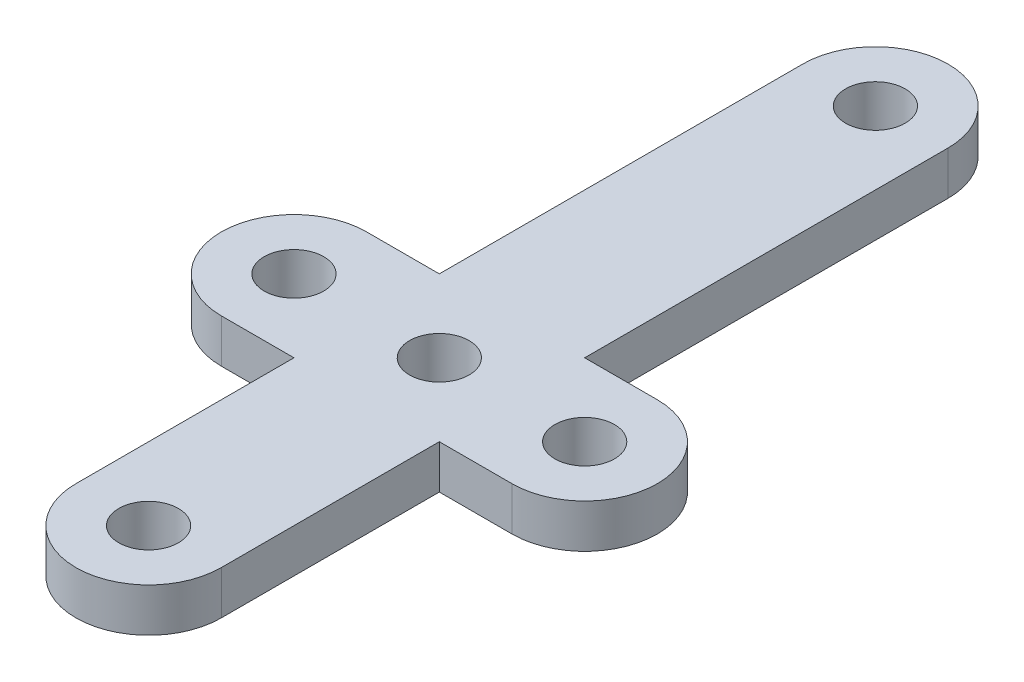
ISO-10303-21;
HEADER;
FILE_DESCRIPTION(('STEP AP214'),'2;1');
FILE_NAME('part.step','',(''),(''),'','','');
FILE_SCHEMA(('AUTOMOTIVE_DESIGN { 1 0 10303 214 1 1 1 1 }'));
ENDSEC;
DATA;
#1=APPLICATION_CONTEXT('core data for automotive mechanical design processes');
#2=APPLICATION_PROTOCOL_DEFINITION('international standard','automotive_design',2000,#1);
#3=PRODUCT_CONTEXT('',#1,'mechanical');
#4=PRODUCT('Part','Part','',(#3));
#5=PRODUCT_RELATED_PRODUCT_CATEGORY('part','',(#4));
#6=PRODUCT_DEFINITION_FORMATION('','',#4);
#7=PRODUCT_DEFINITION_CONTEXT('part definition',#1,'design');
#8=PRODUCT_DEFINITION('design','',#6,#7);
#9=PRODUCT_DEFINITION_SHAPE('','',#8);
#10=(LENGTH_UNIT() NAMED_UNIT(*) SI_UNIT(.MILLI.,.METRE.));
#11=(NAMED_UNIT(*) PLANE_ANGLE_UNIT() SI_UNIT($,.RADIAN.));
#12=(NAMED_UNIT(*) SI_UNIT($,.STERADIAN.) SOLID_ANGLE_UNIT());
#13=UNCERTAINTY_MEASURE_WITH_UNIT(LENGTH_MEASURE(1.E-05),#10,'distance_accuracy_value','');
#14=(GEOMETRIC_REPRESENTATION_CONTEXT(3) GLOBAL_UNCERTAINTY_ASSIGNED_CONTEXT((#13)) GLOBAL_UNIT_ASSIGNED_CONTEXT((#10,
#11,#12)) REPRESENTATION_CONTEXT('',''));
#15=CARTESIAN_POINT('',(0.,0.,0.));
#16=DIRECTION('',(0.,0.,1.));
#17=DIRECTION('',(1.,0.,0.));
#18=AXIS2_PLACEMENT_3D('',#15,#16,#17);
#19=CARTESIAN_POINT('',(-10.,1.5,5.));
#20=DIRECTION('',(0.,1.,0.));
#21=DIRECTION('',(0.,0.,1.));
#22=AXIS2_PLACEMENT_3D('',#19,#20,#21);
#23=PLANE('',#22);
#24=CARTESIAN_POINT('',(0.,1.5,-25.));
#25=DIRECTION('',(0.,1.,0.));
#26=DIRECTION('',(0.,0.,1.));
#27=AXIS2_PLACEMENT_3D('',#24,#25,#26);
#28=CIRCLE('',#27,2.05000000000001);
#29=CARTESIAN_POINT('',(0.,1.5,-22.95));
#30=VERTEX_POINT('',#29);
#31=EDGE_CURVE('E340',#30,#30,#28,.T.);
#32=ORIENTED_EDGE('',*,*,#31,.F.);
#33=EDGE_LOOP('',(#32));
#34=FACE_BOUND('',#33,.T.);
#35=CARTESIAN_POINT('',(-10.,1.5,5.));
#36=DIRECTION('',(0.,1.,0.));
#37=DIRECTION('',(0.,0.,-1.));
#38=AXIS2_PLACEMENT_3D('',#35,#36,#37);
#39=CIRCLE('',#38,2.05);
#40=CARTESIAN_POINT('',(-10.,1.5,2.95));
#41=VERTEX_POINT('',#40);
#42=EDGE_CURVE('E356',#41,#41,#39,.T.);
#43=ORIENTED_EDGE('',*,*,#42,.F.);
#44=EDGE_LOOP('',(#43));
#45=FACE_BOUND('',#44,.T.);
#46=CARTESIAN_POINT('',(-10.,1.5,5.));
#47=DIRECTION('',(0.,1.,0.));
#48=DIRECTION('',(0.,0.,1.));
#49=AXIS2_PLACEMENT_3D('',#46,#47,#48);
#50=CIRCLE('',#49,5.);
#51=CARTESIAN_POINT('',(-10.,1.5,0.));
#52=VERTEX_POINT('',#51);
#53=CARTESIAN_POINT('',(-10.,1.5,10.));
#54=VERTEX_POINT('',#53);
#55=EDGE_CURVE('E204',#52,#54,#50,.T.);
#56=ORIENTED_EDGE('',*,*,#55,.T.);
#57=DIRECTION('',(1.,0.,0.));
#58=VECTOR('',#57,1.);
#59=CARTESIAN_POINT('',(-10.,1.5,10.));
#60=LINE('',#59,#58);
#61=CARTESIAN_POINT('',(-5.,1.5,10.));
#62=VERTEX_POINT('',#61);
#63=EDGE_CURVE('E116',#54,#62,#60,.T.);
#64=ORIENTED_EDGE('',*,*,#63,.T.);
#65=DIRECTION('',(0.,0.,1.));
#66=VECTOR('',#65,1.);
#67=CARTESIAN_POINT('',(-5.,1.5,25.));
#68=LINE('',#67,#66);
#69=CARTESIAN_POINT('',(-5.00000000000001,1.5,25.));
#70=VERTEX_POINT('',#69);
#71=EDGE_CURVE('E241',#62,#70,#68,.T.);
#72=ORIENTED_EDGE('',*,*,#71,.T.);
#73=CARTESIAN_POINT('',(0.,1.5,25.));
#74=DIRECTION('',(0.,1.,0.));
#75=DIRECTION('',(0.,0.,1.));
#76=AXIS2_PLACEMENT_3D('',#73,#74,#75);
#77=CIRCLE('',#76,5.);
#78=CARTESIAN_POINT('',(5.00000000000001,1.5,25.));
#79=VERTEX_POINT('',#78);
#80=EDGE_CURVE('E261',#70,#79,#77,.T.);
#81=ORIENTED_EDGE('',*,*,#80,.T.);
#82=DIRECTION('',(0.,0.,-1.));
#83=VECTOR('',#82,1.);
#84=CARTESIAN_POINT('',(5.00000000000001,1.5,25.));
#85=LINE('',#84,#83);
#86=CARTESIAN_POINT('',(5.,1.5,10.));
#87=VERTEX_POINT('',#86);
#88=EDGE_CURVE('E257',#79,#87,#85,.T.);
#89=ORIENTED_EDGE('',*,*,#88,.T.);
#90=DIRECTION('',(1.,0.,0.));
#91=VECTOR('',#90,1.);
#92=CARTESIAN_POINT('',(5.,1.5,10.));
#93=LINE('',#92,#91);
#94=CARTESIAN_POINT('',(10.,1.5,10.));
#95=VERTEX_POINT('',#94);
#96=EDGE_CURVE('E260',#87,#95,#93,.T.);
#97=ORIENTED_EDGE('',*,*,#96,.T.);
#98=CARTESIAN_POINT('',(10.,1.5,5.));
#99=DIRECTION('',(0.,1.,0.));
#100=DIRECTION('',(0.,0.,1.));
#101=AXIS2_PLACEMENT_3D('',#98,#99,#100);
#102=CIRCLE('',#101,5.);
#103=CARTESIAN_POINT('',(10.,1.5,0.));
#104=VERTEX_POINT('',#103);
#105=EDGE_CURVE('E265',#95,#104,#102,.T.);
#106=ORIENTED_EDGE('',*,*,#105,.T.);
#107=DIRECTION('',(-1.,0.,0.));
#108=VECTOR('',#107,1.);
#109=CARTESIAN_POINT('',(5.,1.5,0.));
#110=LINE('',#109,#108);
#111=CARTESIAN_POINT('',(5.,1.5,0.));
#112=VERTEX_POINT('',#111);
#113=EDGE_CURVE('E272',#104,#112,#110,.T.);
#114=ORIENTED_EDGE('',*,*,#113,.T.);
#115=DIRECTION('',(0.,0.,-1.));
#116=VECTOR('',#115,1.);
#117=CARTESIAN_POINT('',(5.,1.5,0.));
#118=LINE('',#117,#116);
#119=CARTESIAN_POINT('',(5.,1.5,-25.));
#120=VERTEX_POINT('',#119);
#121=EDGE_CURVE('E147',#112,#120,#118,.T.);
#122=ORIENTED_EDGE('',*,*,#121,.T.);
#123=CARTESIAN_POINT('',(0.,1.5,-25.));
#124=DIRECTION('',(0.,1.,0.));
#125=DIRECTION('',(0.,0.,-1.));
#126=AXIS2_PLACEMENT_3D('',#123,#124,#125);
#127=CIRCLE('',#126,5.);
#128=CARTESIAN_POINT('',(-5.,1.5,-25.));
#129=VERTEX_POINT('',#128);
#130=EDGE_CURVE('E141',#120,#129,#127,.T.);
#131=ORIENTED_EDGE('',*,*,#130,.T.);
#132=DIRECTION('',(0.,0.,1.));
#133=VECTOR('',#132,1.);
#134=CARTESIAN_POINT('',(-5.,1.5,0.));
#135=LINE('',#134,#133);
#136=CARTESIAN_POINT('',(-5.,1.5,0.));
#137=VERTEX_POINT('',#136);
#138=EDGE_CURVE('E145',#129,#137,#135,.T.);
#139=ORIENTED_EDGE('',*,*,#138,.T.);
#140=DIRECTION('',(-1.,0.,0.));
#141=VECTOR('',#140,1.);
#142=CARTESIAN_POINT('',(-10.,1.5,0.));
#143=LINE('',#142,#141);
#144=EDGE_CURVE('E61',#137,#52,#143,.T.);
#145=ORIENTED_EDGE('',*,*,#144,.T.);
#146=EDGE_LOOP('',(#56,#64,#72,#81,#89,#97,#106,#114,#122,#131,#139,#145));
#147=FACE_BOUND('',#146,.T.);
#148=CARTESIAN_POINT('',(10.,1.5,5.));
#149=DIRECTION('',(0.,1.,0.));
#150=DIRECTION('',(0.,0.,1.));
#151=AXIS2_PLACEMENT_3D('',#148,#149,#150);
#152=CIRCLE('',#151,2.05);
#153=CARTESIAN_POINT('',(10.,1.5,7.05));
#154=VERTEX_POINT('',#153);
#155=EDGE_CURVE('E174',#154,#154,#152,.T.);
#156=ORIENTED_EDGE('',*,*,#155,.F.);
#157=EDGE_LOOP('',(#156));
#158=FACE_BOUND('',#157,.T.);
#159=CARTESIAN_POINT('',(0.,1.5,5.));
#160=DIRECTION('',(0.,1.,0.));
#161=DIRECTION('',(0.,0.,1.));
#162=AXIS2_PLACEMENT_3D('',#159,#160,#161);
#163=CIRCLE('',#162,2.05);
#164=CARTESIAN_POINT('',(0.,1.5,7.05));
#165=VERTEX_POINT('',#164);
#166=EDGE_CURVE('E348',#165,#165,#163,.T.);
#167=ORIENTED_EDGE('',*,*,#166,.F.);
#168=EDGE_LOOP('',(#167));
#169=FACE_BOUND('',#168,.T.);
#170=CARTESIAN_POINT('',(0.,1.5,25.));
#171=DIRECTION('',(0.,1.,0.));
#172=DIRECTION('',(0.,0.,-1.));
#173=AXIS2_PLACEMENT_3D('',#170,#171,#172);
#174=CIRCLE('',#173,2.04999999999999);
#175=CARTESIAN_POINT('',(0.,1.5,22.95));
#176=VERTEX_POINT('',#175);
#177=EDGE_CURVE('E329',#176,#176,#174,.T.);
#178=ORIENTED_EDGE('',*,*,#177,.F.);
#179=EDGE_LOOP('',(#178));
#180=FACE_BOUND('',#179,.T.);
#181=ADVANCED_FACE('F43',(#34,#45,#147,#158,#169,#180),#23,.T.);
#182=CARTESIAN_POINT('',(-10.,-1.5,5.));
#183=DIRECTION('',(0.,1.,0.));
#184=DIRECTION('',(0.,0.,1.));
#185=AXIS2_PLACEMENT_3D('',#182,#183,#184);
#186=PLANE('',#185);
#187=CARTESIAN_POINT('',(-10.,-1.5,5.));
#188=DIRECTION('',(0.,1.,0.));
#189=DIRECTION('',(0.,0.,1.));
#190=AXIS2_PLACEMENT_3D('',#187,#188,#189);
#191=CIRCLE('',#190,5.);
#192=CARTESIAN_POINT('',(-10.,-1.5,0.));
#193=VERTEX_POINT('',#192);
#194=CARTESIAN_POINT('',(-10.,-1.5,10.));
#195=VERTEX_POINT('',#194);
#196=EDGE_CURVE('E169',#193,#195,#191,.T.);
#197=ORIENTED_EDGE('',*,*,#196,.F.);
#198=DIRECTION('',(-1.,0.,0.));
#199=VECTOR('',#198,1.);
#200=CARTESIAN_POINT('',(-10.,-1.5,0.));
#201=LINE('',#200,#199);
#202=CARTESIAN_POINT('',(-5.,-1.5,0.));
#203=VERTEX_POINT('',#202);
#204=EDGE_CURVE('E108',#203,#193,#201,.T.);
#205=ORIENTED_EDGE('',*,*,#204,.F.);
#206=DIRECTION('',(0.,0.,1.));
#207=VECTOR('',#206,1.);
#208=CARTESIAN_POINT('',(-5.,-1.5,0.));
#209=LINE('',#208,#207);
#210=CARTESIAN_POINT('',(-5.,-1.5,-25.));
#211=VERTEX_POINT('',#210);
#212=EDGE_CURVE('E102',#211,#203,#209,.T.);
#213=ORIENTED_EDGE('',*,*,#212,.F.);
#214=CARTESIAN_POINT('',(0.,-1.5,-25.));
#215=DIRECTION('',(0.,1.,0.));
#216=DIRECTION('',(0.,0.,-1.));
#217=AXIS2_PLACEMENT_3D('',#214,#215,#216);
#218=CIRCLE('',#217,5.);
#219=CARTESIAN_POINT('',(5.,-1.5,-25.));
#220=VERTEX_POINT('',#219);
#221=EDGE_CURVE('E156',#220,#211,#218,.T.);
#222=ORIENTED_EDGE('',*,*,#221,.F.);
#223=DIRECTION('',(0.,0.,-1.));
#224=VECTOR('',#223,1.);
#225=CARTESIAN_POINT('',(5.,-1.5,0.));
#226=LINE('',#225,#224);
#227=CARTESIAN_POINT('',(5.,-1.5,0.));
#228=VERTEX_POINT('',#227);
#229=EDGE_CURVE('E195',#228,#220,#226,.T.);
#230=ORIENTED_EDGE('',*,*,#229,.F.);
#231=DIRECTION('',(-1.,0.,0.));
#232=VECTOR('',#231,1.);
#233=CARTESIAN_POINT('',(5.,-1.5,0.));
#234=LINE('',#233,#232);
#235=CARTESIAN_POINT('',(10.,-1.5,0.));
#236=VERTEX_POINT('',#235);
#237=EDGE_CURVE('E192',#236,#228,#234,.T.);
#238=ORIENTED_EDGE('',*,*,#237,.F.);
#239=CARTESIAN_POINT('',(10.,-1.5,5.));
#240=DIRECTION('',(0.,1.,0.));
#241=DIRECTION('',(0.,0.,1.));
#242=AXIS2_PLACEMENT_3D('',#239,#240,#241);
#243=CIRCLE('',#242,5.);
#244=CARTESIAN_POINT('',(10.,-1.5,10.));
#245=VERTEX_POINT('',#244);
#246=EDGE_CURVE('E189',#245,#236,#243,.T.);
#247=ORIENTED_EDGE('',*,*,#246,.F.);
#248=DIRECTION('',(1.,0.,0.));
#249=VECTOR('',#248,1.);
#250=CARTESIAN_POINT('',(5.,-1.5,10.));
#251=LINE('',#250,#249);
#252=CARTESIAN_POINT('',(5.,-1.5,10.));
#253=VERTEX_POINT('',#252);
#254=EDGE_CURVE('E186',#253,#245,#251,.T.);
#255=ORIENTED_EDGE('',*,*,#254,.F.);
#256=DIRECTION('',(0.,0.,-1.));
#257=VECTOR('',#256,1.);
#258=CARTESIAN_POINT('',(5.00000000000001,-1.5,25.));
#259=LINE('',#258,#257);
#260=CARTESIAN_POINT('',(5.00000000000001,-1.5,25.));
#261=VERTEX_POINT('',#260);
#262=EDGE_CURVE('E183',#261,#253,#259,.T.);
#263=ORIENTED_EDGE('',*,*,#262,.F.);
#264=CARTESIAN_POINT('',(0.,-1.5,25.));
#265=DIRECTION('',(0.,1.,0.));
#266=DIRECTION('',(0.,0.,1.));
#267=AXIS2_PLACEMENT_3D('',#264,#265,#266);
#268=CIRCLE('',#267,5.);
#269=CARTESIAN_POINT('',(-5.00000000000001,-1.5,25.));
#270=VERTEX_POINT('',#269);
#271=EDGE_CURVE('E180',#270,#261,#268,.T.);
#272=ORIENTED_EDGE('',*,*,#271,.F.);
#273=DIRECTION('',(0.,0.,1.));
#274=VECTOR('',#273,1.);
#275=CARTESIAN_POINT('',(-5.,-1.5,25.));
#276=LINE('',#275,#274);
#277=CARTESIAN_POINT('',(-5.,-1.5,10.));
#278=VERTEX_POINT('',#277);
#279=EDGE_CURVE('E177',#278,#270,#276,.T.);
#280=ORIENTED_EDGE('',*,*,#279,.F.);
#281=DIRECTION('',(1.,0.,0.));
#282=VECTOR('',#281,1.);
#283=CARTESIAN_POINT('',(-10.,-1.5,10.));
#284=LINE('',#283,#282);
#285=EDGE_CURVE('E173',#195,#278,#284,.T.);
#286=ORIENTED_EDGE('',*,*,#285,.F.);
#287=EDGE_LOOP('',(#197,#205,#213,#222,#230,#238,#247,#255,#263,#272,#280,#286));
#288=FACE_BOUND('',#287,.T.);
#289=CARTESIAN_POINT('',(10.,-1.5,5.));
#290=DIRECTION('',(0.,1.,0.));
#291=DIRECTION('',(0.,0.,1.));
#292=AXIS2_PLACEMENT_3D('',#289,#290,#291);
#293=CIRCLE('',#292,2.05);
#294=CARTESIAN_POINT('',(10.,-1.5,7.05));
#295=VERTEX_POINT('',#294);
#296=EDGE_CURVE('E360',#295,#295,#293,.T.);
#297=ORIENTED_EDGE('',*,*,#296,.T.);
#298=EDGE_LOOP('',(#297));
#299=FACE_BOUND('',#298,.T.);
#300=CARTESIAN_POINT('',(-10.,-1.5,5.));
#301=DIRECTION('',(0.,1.,0.));
#302=DIRECTION('',(0.,0.,-1.));
#303=AXIS2_PLACEMENT_3D('',#300,#301,#302);
#304=CIRCLE('',#303,2.05);
#305=CARTESIAN_POINT('',(-10.,-1.5,2.95));
#306=VERTEX_POINT('',#305);
#307=EDGE_CURVE('E352',#306,#306,#304,.T.);
#308=ORIENTED_EDGE('',*,*,#307,.T.);
#309=EDGE_LOOP('',(#308));
#310=FACE_BOUND('',#309,.T.);
#311=CARTESIAN_POINT('',(0.,-1.5,5.));
#312=DIRECTION('',(0.,1.,0.));
#313=DIRECTION('',(0.,0.,1.));
#314=AXIS2_PLACEMENT_3D('',#311,#312,#313);
#315=CIRCLE('',#314,2.05);
#316=CARTESIAN_POINT('',(0.,-1.5,7.05));
#317=VERTEX_POINT('',#316);
#318=EDGE_CURVE('E344',#317,#317,#315,.T.);
#319=ORIENTED_EDGE('',*,*,#318,.T.);
#320=EDGE_LOOP('',(#319));
#321=FACE_BOUND('',#320,.T.);
#322=CARTESIAN_POINT('',(0.,-1.5,-25.));
#323=DIRECTION('',(0.,1.,0.));
#324=DIRECTION('',(0.,0.,1.));
#325=AXIS2_PLACEMENT_3D('',#322,#323,#324);
#326=CIRCLE('',#325,2.05000000000001);
#327=CARTESIAN_POINT('',(0.,-1.5,-22.95));
#328=VERTEX_POINT('',#327);
#329=EDGE_CURVE('E337',#328,#328,#326,.T.);
#330=ORIENTED_EDGE('',*,*,#329,.T.);
#331=EDGE_LOOP('',(#330));
#332=FACE_BOUND('',#331,.T.);
#333=CARTESIAN_POINT('',(0.,-1.5,25.));
#334=DIRECTION('',(0.,1.,0.));
#335=DIRECTION('',(0.,0.,-1.));
#336=AXIS2_PLACEMENT_3D('',#333,#334,#335);
#337=CIRCLE('',#336,2.04999999999999);
#338=CARTESIAN_POINT('',(0.,-1.5,22.95));
#339=VERTEX_POINT('',#338);
#340=EDGE_CURVE('E332',#339,#339,#337,.T.);
#341=ORIENTED_EDGE('',*,*,#340,.T.);
#342=EDGE_LOOP('',(#341));
#343=FACE_BOUND('',#342,.T.);
#344=ADVANCED_FACE('F245',(#288,#299,#310,#321,#332,#343),#186,.F.);
#345=CARTESIAN_POINT('',(-10.,1.5,5.));
#346=DIRECTION('',(0.,-1.,0.));
#347=DIRECTION('',(0.,0.,-1.));
#348=AXIS2_PLACEMENT_3D('',#345,#346,#347);
#349=CYLINDRICAL_SURFACE('',#348,5.);
#350=ORIENTED_EDGE('',*,*,#196,.T.);
#351=DIRECTION('',(0.,-1.,0.));
#352=VECTOR('',#351,1.);
#353=CARTESIAN_POINT('',(-10.,1.5,10.));
#354=LINE('',#353,#352);
#355=EDGE_CURVE('E11',#54,#195,#354,.T.);
#356=ORIENTED_EDGE('',*,*,#355,.F.);
#357=ORIENTED_EDGE('',*,*,#55,.F.);
#358=DIRECTION('',(0.,-1.,0.));
#359=VECTOR('',#358,1.);
#360=CARTESIAN_POINT('',(-10.,1.5,0.));
#361=LINE('',#360,#359);
#362=EDGE_CURVE('E165',#52,#193,#361,.T.);
#363=ORIENTED_EDGE('',*,*,#362,.T.);
#364=EDGE_LOOP('',(#350,#356,#357,#363));
#365=FACE_BOUND('',#364,.T.);
#366=ADVANCED_FACE('F45',(#365),#349,.T.);
#367=CARTESIAN_POINT('',(-10.,1.5,10.));
#368=DIRECTION('',(0.,0.,-1.));
#369=DIRECTION('',(-1.,0.,0.));
#370=AXIS2_PLACEMENT_3D('',#367,#368,#369);
#371=PLANE('',#370);
#372=ORIENTED_EDGE('',*,*,#285,.T.);
#373=DIRECTION('',(0.,-1.,0.));
#374=VECTOR('',#373,1.);
#375=CARTESIAN_POINT('',(-5.,1.5,10.));
#376=LINE('',#375,#374);
#377=EDGE_CURVE('E53',#62,#278,#376,.T.);
#378=ORIENTED_EDGE('',*,*,#377,.F.);
#379=ORIENTED_EDGE('',*,*,#63,.F.);
#380=ORIENTED_EDGE('',*,*,#355,.T.);
#381=EDGE_LOOP('',(#372,#378,#379,#380));
#382=FACE_BOUND('',#381,.T.);
#383=ADVANCED_FACE('F495',(#382),#371,.F.);
#384=CARTESIAN_POINT('',(-5.,1.5,25.));
#385=DIRECTION('',(1.,0.,0.));
#386=DIRECTION('',(0.,0.,-1.));
#387=AXIS2_PLACEMENT_3D('',#384,#385,#386);
#388=PLANE('',#387);
#389=ORIENTED_EDGE('',*,*,#279,.T.);
#390=DIRECTION('',(0.,-1.,0.));
#391=VECTOR('',#390,1.);
#392=CARTESIAN_POINT('',(-5.00000000000001,1.5,25.));
#393=LINE('',#392,#391);
#394=EDGE_CURVE('E231',#70,#270,#393,.T.);
#395=ORIENTED_EDGE('',*,*,#394,.F.);
#396=ORIENTED_EDGE('',*,*,#71,.F.);
#397=ORIENTED_EDGE('',*,*,#377,.T.);
#398=EDGE_LOOP('',(#389,#395,#396,#397));
#399=FACE_BOUND('',#398,.T.);
#400=ADVANCED_FACE('F239',(#399),#388,.F.);
#401=CARTESIAN_POINT('',(0.,1.5,25.));
#402=DIRECTION('',(0.,-1.,0.));
#403=DIRECTION('',(0.,0.,-1.));
#404=AXIS2_PLACEMENT_3D('',#401,#402,#403);
#405=CYLINDRICAL_SURFACE('',#404,5.);
#406=ORIENTED_EDGE('',*,*,#271,.T.);
#407=DIRECTION('',(0.,-1.,0.));
#408=VECTOR('',#407,1.);
#409=CARTESIAN_POINT('',(5.00000000000001,1.5,25.));
#410=LINE('',#409,#408);
#411=EDGE_CURVE('E227',#79,#261,#410,.T.);
#412=ORIENTED_EDGE('',*,*,#411,.F.);
#413=ORIENTED_EDGE('',*,*,#80,.F.);
#414=ORIENTED_EDGE('',*,*,#394,.T.);
#415=EDGE_LOOP('',(#406,#412,#413,#414));
#416=FACE_BOUND('',#415,.T.);
#417=ADVANCED_FACE('F251',(#416),#405,.T.);
#418=CARTESIAN_POINT('',(5.00000000000001,1.5,25.));
#419=DIRECTION('',(-1.,0.,0.));
#420=DIRECTION('',(0.,0.,1.));
#421=AXIS2_PLACEMENT_3D('',#418,#419,#420);
#422=PLANE('',#421);
#423=ORIENTED_EDGE('',*,*,#262,.T.);
#424=DIRECTION('',(0.,-1.,0.));
#425=VECTOR('',#424,1.);
#426=CARTESIAN_POINT('',(5.,1.5,10.));
#427=LINE('',#426,#425);
#428=EDGE_CURVE('E223',#87,#253,#427,.T.);
#429=ORIENTED_EDGE('',*,*,#428,.F.);
#430=ORIENTED_EDGE('',*,*,#88,.F.);
#431=ORIENTED_EDGE('',*,*,#411,.T.);
#432=EDGE_LOOP('',(#423,#429,#430,#431));
#433=FACE_BOUND('',#432,.T.);
#434=ADVANCED_FACE('F255',(#433),#422,.F.);
#435=CARTESIAN_POINT('',(5.,1.5,10.));
#436=DIRECTION('',(0.,0.,-1.));
#437=DIRECTION('',(-1.,0.,0.));
#438=AXIS2_PLACEMENT_3D('',#435,#436,#437);
#439=PLANE('',#438);
#440=ORIENTED_EDGE('',*,*,#254,.T.);
#441=DIRECTION('',(0.,-1.,0.));
#442=VECTOR('',#441,1.);
#443=CARTESIAN_POINT('',(10.,1.5,10.));
#444=LINE('',#443,#442);
#445=EDGE_CURVE('E219',#95,#245,#444,.T.);
#446=ORIENTED_EDGE('',*,*,#445,.F.);
#447=ORIENTED_EDGE('',*,*,#96,.F.);
#448=ORIENTED_EDGE('',*,*,#428,.T.);
#449=EDGE_LOOP('',(#440,#446,#447,#448));
#450=FACE_BOUND('',#449,.T.);
#451=ADVANCED_FACE('F456',(#450),#439,.F.);
#452=CARTESIAN_POINT('',(10.,1.5,5.));
#453=DIRECTION('',(0.,-1.,0.));
#454=DIRECTION('',(0.,0.,-1.));
#455=AXIS2_PLACEMENT_3D('',#452,#453,#454);
#456=CYLINDRICAL_SURFACE('',#455,5.);
#457=ORIENTED_EDGE('',*,*,#246,.T.);
#458=DIRECTION('',(0.,-1.,0.));
#459=VECTOR('',#458,1.);
#460=CARTESIAN_POINT('',(10.,1.5,0.));
#461=LINE('',#460,#459);
#462=EDGE_CURVE('E215',#104,#236,#461,.T.);
#463=ORIENTED_EDGE('',*,*,#462,.F.);
#464=ORIENTED_EDGE('',*,*,#105,.F.);
#465=ORIENTED_EDGE('',*,*,#445,.T.);
#466=EDGE_LOOP('',(#457,#463,#464,#465));
#467=FACE_BOUND('',#466,.T.);
#468=ADVANCED_FACE('F446',(#467),#456,.T.);
#469=CARTESIAN_POINT('',(5.,1.5,0.));
#470=DIRECTION('',(0.,0.,1.));
#471=DIRECTION('',(1.,0.,0.));
#472=AXIS2_PLACEMENT_3D('',#469,#470,#471);
#473=PLANE('',#472);
#474=ORIENTED_EDGE('',*,*,#237,.T.);
#475=DIRECTION('',(0.,-1.,0.));
#476=VECTOR('',#475,1.);
#477=CARTESIAN_POINT('',(5.,1.5,0.));
#478=LINE('',#477,#476);
#479=EDGE_CURVE('E211',#112,#228,#478,.T.);
#480=ORIENTED_EDGE('',*,*,#479,.F.);
#481=ORIENTED_EDGE('',*,*,#113,.F.);
#482=ORIENTED_EDGE('',*,*,#462,.T.);
#483=EDGE_LOOP('',(#474,#480,#481,#482));
#484=FACE_BOUND('',#483,.T.);
#485=ADVANCED_FACE('F280',(#484),#473,.F.);
#486=CARTESIAN_POINT('',(5.,1.5,0.));
#487=DIRECTION('',(-1.,0.,0.));
#488=DIRECTION('',(0.,0.,1.));
#489=AXIS2_PLACEMENT_3D('',#486,#487,#488);
#490=PLANE('',#489);
#491=ORIENTED_EDGE('',*,*,#229,.T.);
#492=DIRECTION('',(0.,-1.,0.));
#493=VECTOR('',#492,1.);
#494=CARTESIAN_POINT('',(5.,1.5,-25.));
#495=LINE('',#494,#493);
#496=EDGE_CURVE('E158',#120,#220,#495,.T.);
#497=ORIENTED_EDGE('',*,*,#496,.F.);
#498=ORIENTED_EDGE('',*,*,#121,.F.);
#499=ORIENTED_EDGE('',*,*,#479,.T.);
#500=EDGE_LOOP('',(#491,#497,#498,#499));
#501=FACE_BOUND('',#500,.T.);
#502=ADVANCED_FACE('F284',(#501),#490,.F.);
#503=CARTESIAN_POINT('',(0.,1.5,-25.));
#504=DIRECTION('',(0.,-1.,0.));
#505=DIRECTION('',(0.,0.,-1.));
#506=AXIS2_PLACEMENT_3D('',#503,#504,#505);
#507=CYLINDRICAL_SURFACE('',#506,5.);
#508=ORIENTED_EDGE('',*,*,#221,.T.);
#509=DIRECTION('',(0.,-1.,0.));
#510=VECTOR('',#509,1.);
#511=CARTESIAN_POINT('',(-5.,1.5,-25.));
#512=LINE('',#511,#510);
#513=EDGE_CURVE('E153',#129,#211,#512,.T.);
#514=ORIENTED_EDGE('',*,*,#513,.F.);
#515=ORIENTED_EDGE('',*,*,#130,.F.);
#516=ORIENTED_EDGE('',*,*,#496,.T.);
#517=EDGE_LOOP('',(#508,#514,#515,#516));
#518=FACE_BOUND('',#517,.T.);
#519=ADVANCED_FACE('F154',(#518),#507,.T.);
#520=CARTESIAN_POINT('',(-5.,1.5,0.));
#521=DIRECTION('',(1.,0.,0.));
#522=DIRECTION('',(0.,0.,-1.));
#523=AXIS2_PLACEMENT_3D('',#520,#521,#522);
#524=PLANE('',#523);
#525=ORIENTED_EDGE('',*,*,#212,.T.);
#526=DIRECTION('',(0.,-1.,0.));
#527=VECTOR('',#526,1.);
#528=CARTESIAN_POINT('',(-5.,1.5,0.));
#529=LINE('',#528,#527);
#530=EDGE_CURVE('E159',#137,#203,#529,.T.);
#531=ORIENTED_EDGE('',*,*,#530,.F.);
#532=ORIENTED_EDGE('',*,*,#138,.F.);
#533=ORIENTED_EDGE('',*,*,#513,.T.);
#534=EDGE_LOOP('',(#525,#531,#532,#533));
#535=FACE_BOUND('',#534,.T.);
#536=ADVANCED_FACE('F161',(#535),#524,.F.);
#537=CARTESIAN_POINT('',(-10.,1.5,0.));
#538=DIRECTION('',(0.,0.,1.));
#539=DIRECTION('',(1.,0.,0.));
#540=AXIS2_PLACEMENT_3D('',#537,#538,#539);
#541=PLANE('',#540);
#542=ORIENTED_EDGE('',*,*,#204,.T.);
#543=ORIENTED_EDGE('',*,*,#362,.F.);
#544=ORIENTED_EDGE('',*,*,#144,.F.);
#545=ORIENTED_EDGE('',*,*,#530,.T.);
#546=EDGE_LOOP('',(#542,#543,#544,#545));
#547=FACE_BOUND('',#546,.T.);
#548=ADVANCED_FACE('F288',(#547),#541,.F.);
#549=CARTESIAN_POINT('',(10.,1.5,5.));
#550=DIRECTION('',(0.,-1.,0.));
#551=DIRECTION('',(0.,0.,-1.));
#552=AXIS2_PLACEMENT_3D('',#549,#550,#551);
#553=CYLINDRICAL_SURFACE('',#552,2.05);
#554=ORIENTED_EDGE('',*,*,#155,.T.);
#555=EDGE_LOOP('',(#554));
#556=FACE_BOUND('',#555,.T.);
#557=ORIENTED_EDGE('',*,*,#296,.F.);
#558=EDGE_LOOP('',(#557));
#559=FACE_BOUND('',#558,.T.);
#560=ADVANCED_FACE('F290',(#556,#559),#553,.F.);
#561=CARTESIAN_POINT('',(-10.,1.5,5.));
#562=DIRECTION('',(0.,-1.,0.));
#563=DIRECTION('',(0.,0.,-1.));
#564=AXIS2_PLACEMENT_3D('',#561,#562,#563);
#565=CYLINDRICAL_SURFACE('',#564,2.05);
#566=ORIENTED_EDGE('',*,*,#42,.T.);
#567=EDGE_LOOP('',(#566));
#568=FACE_BOUND('',#567,.T.);
#569=ORIENTED_EDGE('',*,*,#307,.F.);
#570=EDGE_LOOP('',(#569));
#571=FACE_BOUND('',#570,.T.);
#572=ADVANCED_FACE('F296',(#568,#571),#565,.F.);
#573=CARTESIAN_POINT('',(0.,1.5,5.));
#574=DIRECTION('',(0.,-1.,0.));
#575=DIRECTION('',(0.,0.,-1.));
#576=AXIS2_PLACEMENT_3D('',#573,#574,#575);
#577=CYLINDRICAL_SURFACE('',#576,2.05);
#578=ORIENTED_EDGE('',*,*,#166,.T.);
#579=EDGE_LOOP('',(#578));
#580=FACE_BOUND('',#579,.T.);
#581=ORIENTED_EDGE('',*,*,#318,.F.);
#582=EDGE_LOOP('',(#581));
#583=FACE_BOUND('',#582,.T.);
#584=ADVANCED_FACE('F312',(#580,#583),#577,.F.);
#585=CARTESIAN_POINT('',(0.,1.5,-25.));
#586=DIRECTION('',(0.,-1.,0.));
#587=DIRECTION('',(0.,0.,-1.));
#588=AXIS2_PLACEMENT_3D('',#585,#586,#587);
#589=CYLINDRICAL_SURFACE('',#588,2.05000000000001);
#590=ORIENTED_EDGE('',*,*,#31,.T.);
#591=EDGE_LOOP('',(#590));
#592=FACE_BOUND('',#591,.T.);
#593=ORIENTED_EDGE('',*,*,#329,.F.);
#594=EDGE_LOOP('',(#593));
#595=FACE_BOUND('',#594,.T.);
#596=ADVANCED_FACE('F316',(#592,#595),#589,.F.);
#597=CARTESIAN_POINT('',(0.,1.5,25.));
#598=DIRECTION('',(0.,-1.,0.));
#599=DIRECTION('',(0.,0.,-1.));
#600=AXIS2_PLACEMENT_3D('',#597,#598,#599);
#601=CYLINDRICAL_SURFACE('',#600,2.04999999999999);
#602=ORIENTED_EDGE('',*,*,#177,.T.);
#603=EDGE_LOOP('',(#602));
#604=FACE_BOUND('',#603,.T.);
#605=ORIENTED_EDGE('',*,*,#340,.F.);
#606=EDGE_LOOP('',(#605));
#607=FACE_BOUND('',#606,.T.);
#608=ADVANCED_FACE('F320',(#604,#607),#601,.F.);
#609=CLOSED_SHELL('',(#181,#344,#366,#383,#400,#417,#434,#451,#468,#485,#502,#519,#536,#548,
#560,#572,#584,#596,#608));
#610=MANIFOLD_SOLID_BREP('B2',#609);
#611=ADVANCED_BREP_SHAPE_REPRESENTATION('',(#18,#610),#14);
#612=SHAPE_DEFINITION_REPRESENTATION(#9,#611);
ENDSEC;
END-ISO-10303-21;
